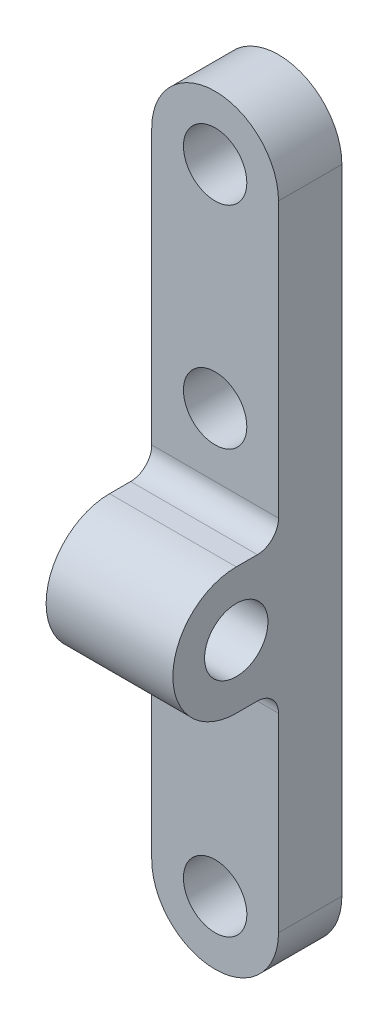
ISO-10303-21;
HEADER;
FILE_DESCRIPTION(('STEP AP214'),'2;1');
FILE_NAME('part.step','',(''),(''),'','','');
FILE_SCHEMA(('AUTOMOTIVE_DESIGN { 1 0 10303 214 1 1 1 1 }'));
ENDSEC;
DATA;
#1=APPLICATION_CONTEXT('core data for automotive mechanical design processes');
#2=APPLICATION_PROTOCOL_DEFINITION('international standard','automotive_design',2000,#1);
#3=PRODUCT_CONTEXT('',#1,'mechanical');
#4=PRODUCT('Part','Part','',(#3));
#5=PRODUCT_RELATED_PRODUCT_CATEGORY('part','',(#4));
#6=PRODUCT_DEFINITION_FORMATION('','',#4);
#7=PRODUCT_DEFINITION_CONTEXT('part definition',#1,'design');
#8=PRODUCT_DEFINITION('design','',#6,#7);
#9=PRODUCT_DEFINITION_SHAPE('','',#8);
#10=(LENGTH_UNIT() NAMED_UNIT(*) SI_UNIT(.MILLI.,.METRE.));
#11=(NAMED_UNIT(*) PLANE_ANGLE_UNIT() SI_UNIT($,.RADIAN.));
#12=(NAMED_UNIT(*) SI_UNIT($,.STERADIAN.) SOLID_ANGLE_UNIT());
#13=UNCERTAINTY_MEASURE_WITH_UNIT(LENGTH_MEASURE(1.E-05),#10,'distance_accuracy_value','');
#14=(GEOMETRIC_REPRESENTATION_CONTEXT(3) GLOBAL_UNCERTAINTY_ASSIGNED_CONTEXT((#13)) GLOBAL_UNIT_ASSIGNED_CONTEXT((#10,
#11,#12)) REPRESENTATION_CONTEXT('',''));
#15=CARTESIAN_POINT('',(0.,0.,0.));
#16=DIRECTION('',(0.,0.,1.));
#17=DIRECTION('',(1.,0.,0.));
#18=AXIS2_PLACEMENT_3D('',#15,#16,#17);
#19=CARTESIAN_POINT('',(0.,0.,3.));
#20=DIRECTION('',(0.,0.,1.));
#21=DIRECTION('',(1.,0.,0.));
#22=AXIS2_PLACEMENT_3D('',#19,#20,#21);
#23=PLANE('',#22);
#24=CARTESIAN_POINT('',(0.,-10.,3.));
#25=DIRECTION('',(0.,0.,1.));
#26=DIRECTION('',(1.,0.,0.));
#27=AXIS2_PLACEMENT_3D('',#24,#25,#26);
#28=CIRCLE('',#27,1.5);
#29=CARTESIAN_POINT('',(1.5,-10.,3.));
#30=VERTEX_POINT('',#29);
#31=EDGE_CURVE('E237',#30,#30,#28,.T.);
#32=ORIENTED_EDGE('',*,*,#31,.F.);
#33=EDGE_LOOP('',(#32));
#34=FACE_BOUND('',#33,.T.);
#35=DIRECTION('',(0.,-1.,0.));
#36=VECTOR('',#35,1.);
#37=CARTESIAN_POINT('',(-3.,0.,3.));
#38=LINE('',#37,#36);
#39=CARTESIAN_POINT('',(-3.,0.,3.));
#40=VERTEX_POINT('',#39);
#41=CARTESIAN_POINT('',(-3.,-13.,3.));
#42=VERTEX_POINT('',#41);
#43=EDGE_CURVE('E162',#40,#42,#38,.T.);
#44=ORIENTED_EDGE('',*,*,#43,.T.);
#45=DIRECTION('',(-1.,0.,0.));
#46=VECTOR('',#45,1.);
#47=CARTESIAN_POINT('',(3.,-13.,3.));
#48=LINE('',#47,#46);
#49=CARTESIAN_POINT('',(3.,-13.,3.));
#50=VERTEX_POINT('',#49);
#51=EDGE_CURVE('E55',#42,#50,#48,.F.);
#52=ORIENTED_EDGE('',*,*,#51,.T.);
#53=DIRECTION('',(0.,1.,0.));
#54=VECTOR('',#53,1.);
#55=CARTESIAN_POINT('',(3.,0.,3.));
#56=LINE('',#55,#54);
#57=CARTESIAN_POINT('',(3.,0.,3.));
#58=VERTEX_POINT('',#57);
#59=EDGE_CURVE('E166',#50,#58,#56,.T.);
#60=ORIENTED_EDGE('',*,*,#59,.T.);
#61=CARTESIAN_POINT('',(0.,0.,3.));
#62=DIRECTION('',(0.,0.,1.));
#63=DIRECTION('',(1.,0.,0.));
#64=AXIS2_PLACEMENT_3D('',#61,#62,#63);
#65=CIRCLE('',#64,3.);
#66=EDGE_CURVE('E157',#58,#40,#65,.T.);
#67=ORIENTED_EDGE('',*,*,#66,.T.);
#68=EDGE_LOOP('',(#44,#52,#60,#67));
#69=FACE_BOUND('',#68,.T.);
#70=CARTESIAN_POINT('',(0.,0.,3.));
#71=DIRECTION('',(0.,0.,1.));
#72=DIRECTION('',(1.,0.,0.));
#73=AXIS2_PLACEMENT_3D('',#70,#71,#72);
#74=CIRCLE('',#73,1.5);
#75=CARTESIAN_POINT('',(1.5,0.,3.));
#76=VERTEX_POINT('',#75);
#77=EDGE_CURVE('E151',#76,#76,#74,.T.);
#78=ORIENTED_EDGE('',*,*,#77,.F.);
#79=EDGE_LOOP('',(#78));
#80=FACE_BOUND('',#79,.T.);
#81=ADVANCED_FACE('F34',(#34,#69,#80),#23,.T.);
#82=CARTESIAN_POINT('',(3.,-30.,3.));
#83=VERTEX_POINT('',#82);
#84=CARTESIAN_POINT('',(3.,-21.,3.));
#85=VERTEX_POINT('',#84);
#86=EDGE_CURVE('E167',#83,#85,#56,.T.);
#87=ORIENTED_EDGE('',*,*,#86,.T.);
#88=DIRECTION('',(1.,0.,0.));
#89=VECTOR('',#88,1.);
#90=CARTESIAN_POINT('',(-3.,-21.,3.));
#91=LINE('',#90,#89);
#92=CARTESIAN_POINT('',(-3.,-21.,3.));
#93=VERTEX_POINT('',#92);
#94=EDGE_CURVE('E192',#85,#93,#91,.F.);
#95=ORIENTED_EDGE('',*,*,#94,.T.);
#96=CARTESIAN_POINT('',(-3.,-30.,3.));
#97=VERTEX_POINT('',#96);
#98=EDGE_CURVE('E160',#93,#97,#38,.T.);
#99=ORIENTED_EDGE('',*,*,#98,.T.);
#100=CARTESIAN_POINT('',(0.,-30.,3.));
#101=DIRECTION('',(0.,0.,1.));
#102=DIRECTION('',(-1.,0.,0.));
#103=AXIS2_PLACEMENT_3D('',#100,#101,#102);
#104=CIRCLE('',#103,3.);
#105=EDGE_CURVE('E164',#97,#83,#104,.T.);
#106=ORIENTED_EDGE('',*,*,#105,.T.);
#107=EDGE_LOOP('',(#87,#95,#99,#106));
#108=FACE_BOUND('',#107,.T.);
#109=CARTESIAN_POINT('',(0.,-30.,3.));
#110=DIRECTION('',(0.,0.,1.));
#111=DIRECTION('',(-1.,0.,0.));
#112=AXIS2_PLACEMENT_3D('',#109,#110,#111);
#113=CIRCLE('',#112,1.5);
#114=CARTESIAN_POINT('',(-1.5,-30.,3.));
#115=VERTEX_POINT('',#114);
#116=EDGE_CURVE('E145',#115,#115,#113,.T.);
#117=ORIENTED_EDGE('',*,*,#116,.F.);
#118=EDGE_LOOP('',(#117));
#119=FACE_BOUND('',#118,.T.);
#120=ADVANCED_FACE('F216',(#108,#119),#23,.T.);
#121=CARTESIAN_POINT('',(0.,0.,0.));
#122=DIRECTION('',(0.,0.,1.));
#123=DIRECTION('',(1.,0.,0.));
#124=AXIS2_PLACEMENT_3D('',#121,#122,#123);
#125=PLANE('',#124);
#126=CARTESIAN_POINT('',(0.,-10.,0.));
#127=DIRECTION('',(0.,0.,-1.));
#128=DIRECTION('',(-1.,0.,0.));
#129=AXIS2_PLACEMENT_3D('',#126,#127,#128);
#130=CIRCLE('',#129,1.5);
#131=CARTESIAN_POINT('',(-1.5,-10.,0.));
#132=VERTEX_POINT('',#131);
#133=EDGE_CURVE('E243',#132,#132,#130,.T.);
#134=ORIENTED_EDGE('',*,*,#133,.F.);
#135=EDGE_LOOP('',(#134));
#136=FACE_BOUND('',#135,.T.);
#137=CARTESIAN_POINT('',(0.,-30.,0.));
#138=DIRECTION('',(0.,0.,1.));
#139=DIRECTION('',(-1.,0.,0.));
#140=AXIS2_PLACEMENT_3D('',#137,#138,#139);
#141=CIRCLE('',#140,3.);
#142=CARTESIAN_POINT('',(-3.,-30.,0.));
#143=VERTEX_POINT('',#142);
#144=CARTESIAN_POINT('',(3.,-30.,0.));
#145=VERTEX_POINT('',#144);
#146=EDGE_CURVE('E175',#143,#145,#141,.T.);
#147=ORIENTED_EDGE('',*,*,#146,.F.);
#148=DIRECTION('',(0.,-1.,0.));
#149=VECTOR('',#148,1.);
#150=CARTESIAN_POINT('',(-3.,0.,0.));
#151=LINE('',#150,#149);
#152=CARTESIAN_POINT('',(-3.,0.,0.));
#153=VERTEX_POINT('',#152);
#154=EDGE_CURVE('E173',#153,#143,#151,.T.);
#155=ORIENTED_EDGE('',*,*,#154,.F.);
#156=CARTESIAN_POINT('',(0.,0.,0.));
#157=DIRECTION('',(0.,0.,1.));
#158=DIRECTION('',(1.,0.,0.));
#159=AXIS2_PLACEMENT_3D('',#156,#157,#158);
#160=CIRCLE('',#159,3.);
#161=CARTESIAN_POINT('',(3.,0.,0.));
#162=VERTEX_POINT('',#161);
#163=EDGE_CURVE('E154',#162,#153,#160,.T.);
#164=ORIENTED_EDGE('',*,*,#163,.F.);
#165=DIRECTION('',(0.,1.,0.));
#166=VECTOR('',#165,1.);
#167=CARTESIAN_POINT('',(3.,0.,0.));
#168=LINE('',#167,#166);
#169=EDGE_CURVE('E161',#145,#162,#168,.T.);
#170=ORIENTED_EDGE('',*,*,#169,.F.);
#171=EDGE_LOOP('',(#147,#155,#164,#170));
#172=FACE_BOUND('',#171,.T.);
#173=CARTESIAN_POINT('',(0.,-30.,0.));
#174=DIRECTION('',(0.,0.,1.));
#175=DIRECTION('',(-1.,0.,0.));
#176=AXIS2_PLACEMENT_3D('',#173,#174,#175);
#177=CIRCLE('',#176,1.5);
#178=CARTESIAN_POINT('',(-1.5,-30.,0.));
#179=VERTEX_POINT('',#178);
#180=EDGE_CURVE('E144',#179,#179,#177,.T.);
#181=ORIENTED_EDGE('',*,*,#180,.T.);
#182=EDGE_LOOP('',(#181));
#183=FACE_BOUND('',#182,.T.);
#184=CARTESIAN_POINT('',(0.,0.,0.));
#185=DIRECTION('',(0.,0.,1.));
#186=DIRECTION('',(1.,0.,0.));
#187=AXIS2_PLACEMENT_3D('',#184,#185,#186);
#188=CIRCLE('',#187,1.5);
#189=CARTESIAN_POINT('',(1.5,0.,0.));
#190=VERTEX_POINT('',#189);
#191=EDGE_CURVE('E148',#190,#190,#188,.T.);
#192=ORIENTED_EDGE('',*,*,#191,.T.);
#193=EDGE_LOOP('',(#192));
#194=FACE_BOUND('',#193,.T.);
#195=ADVANCED_FACE('F227',(#136,#172,#183,#194),#125,.F.);
#196=CARTESIAN_POINT('',(0.,0.,3.));
#197=DIRECTION('',(0.,0.,-1.));
#198=DIRECTION('',(-1.,0.,0.));
#199=AXIS2_PLACEMENT_3D('',#196,#197,#198);
#200=CYLINDRICAL_SURFACE('',#199,3.);
#201=ORIENTED_EDGE('',*,*,#163,.T.);
#202=DIRECTION('',(0.,0.,-1.));
#203=VECTOR('',#202,1.);
#204=CARTESIAN_POINT('',(-3.,0.,3.));
#205=LINE('',#204,#203);
#206=EDGE_CURVE('E186',#40,#153,#205,.T.);
#207=ORIENTED_EDGE('',*,*,#206,.F.);
#208=ORIENTED_EDGE('',*,*,#66,.F.);
#209=DIRECTION('',(0.,0.,-1.));
#210=VECTOR('',#209,1.);
#211=CARTESIAN_POINT('',(3.,0.,3.));
#212=LINE('',#211,#210);
#213=EDGE_CURVE('E170',#58,#162,#212,.T.);
#214=ORIENTED_EDGE('',*,*,#213,.T.);
#215=EDGE_LOOP('',(#201,#207,#208,#214));
#216=FACE_BOUND('',#215,.T.);
#217=ADVANCED_FACE('F231',(#216),#200,.T.);
#218=CARTESIAN_POINT('',(-3.,0.,3.));
#219=DIRECTION('',(1.,0.,0.));
#220=DIRECTION('',(0.,1.,0.));
#221=AXIS2_PLACEMENT_3D('',#218,#219,#220);
#222=PLANE('',#221);
#223=ORIENTED_EDGE('',*,*,#98,.F.);
#224=CARTESIAN_POINT('',(-3.,-21.,4.));
#225=DIRECTION('',(1.,0.,0.));
#226=DIRECTION('',(0.,1.,0.));
#227=AXIS2_PLACEMENT_3D('',#224,#225,#226);
#228=CIRCLE('',#227,1.);
#229=CARTESIAN_POINT('',(-3.,-20.,4.));
#230=VERTEX_POINT('',#229);
#231=EDGE_CURVE('E199',#93,#230,#228,.T.);
#232=ORIENTED_EDGE('',*,*,#231,.T.);
#233=DIRECTION('',(0.,0.,1.));
#234=VECTOR('',#233,1.);
#235=CARTESIAN_POINT('',(-3.,-20.,5.));
#236=LINE('',#235,#234);
#237=CARTESIAN_POINT('',(-3.,-20.,5.));
#238=VERTEX_POINT('',#237);
#239=EDGE_CURVE('E205',#230,#238,#236,.T.);
#240=ORIENTED_EDGE('',*,*,#239,.T.);
#241=CARTESIAN_POINT('',(-3.,-17.,5.));
#242=DIRECTION('',(1.,0.,0.));
#243=DIRECTION('',(0.,1.,0.));
#244=AXIS2_PLACEMENT_3D('',#241,#242,#243);
#245=CIRCLE('',#244,3.);
#246=CARTESIAN_POINT('',(-3.,-14.,5.));
#247=VERTEX_POINT('',#246);
#248=EDGE_CURVE('E139',#238,#247,#245,.F.);
#249=ORIENTED_EDGE('',*,*,#248,.T.);
#250=DIRECTION('',(0.,0.,-1.));
#251=VECTOR('',#250,1.);
#252=CARTESIAN_POINT('',(-3.,-14.,0.));
#253=LINE('',#252,#251);
#254=CARTESIAN_POINT('',(-3.,-14.,4.));
#255=VERTEX_POINT('',#254);
#256=EDGE_CURVE('E127',#247,#255,#253,.T.);
#257=ORIENTED_EDGE('',*,*,#256,.T.);
#258=CARTESIAN_POINT('',(-3.,-13.,4.));
#259=DIRECTION('',(1.,0.,0.));
#260=DIRECTION('',(0.,1.,0.));
#261=AXIS2_PLACEMENT_3D('',#258,#259,#260);
#262=CIRCLE('',#261,1.);
#263=EDGE_CURVE('E42',#255,#42,#262,.T.);
#264=ORIENTED_EDGE('',*,*,#263,.T.);
#265=ORIENTED_EDGE('',*,*,#43,.F.);
#266=ORIENTED_EDGE('',*,*,#206,.T.);
#267=ORIENTED_EDGE('',*,*,#154,.T.);
#268=DIRECTION('',(0.,0.,-1.));
#269=VECTOR('',#268,1.);
#270=CARTESIAN_POINT('',(-3.,-30.,3.));
#271=LINE('',#270,#269);
#272=EDGE_CURVE('E183',#97,#143,#271,.T.);
#273=ORIENTED_EDGE('',*,*,#272,.F.);
#274=EDGE_LOOP('',(#223,#232,#240,#249,#257,#264,#265,#266,#267,#273));
#275=FACE_BOUND('',#274,.T.);
#276=CARTESIAN_POINT('',(-3.,-17.,5.));
#277=DIRECTION('',(1.,0.,0.));
#278=DIRECTION('',(0.,1.,0.));
#279=AXIS2_PLACEMENT_3D('',#276,#277,#278);
#280=CIRCLE('',#279,1.5);
#281=CARTESIAN_POINT('',(-3.,-15.5,5.));
#282=VERTEX_POINT('',#281);
#283=EDGE_CURVE('E141',#282,#282,#280,.F.);
#284=ORIENTED_EDGE('',*,*,#283,.F.);
#285=EDGE_LOOP('',(#284));
#286=FACE_BOUND('',#285,.T.);
#287=ADVANCED_FACE('F203',(#275,#286),#222,.F.);
#288=CARTESIAN_POINT('',(0.,-30.,3.));
#289=DIRECTION('',(0.,0.,-1.));
#290=DIRECTION('',(-1.,0.,0.));
#291=AXIS2_PLACEMENT_3D('',#288,#289,#290);
#292=CYLINDRICAL_SURFACE('',#291,3.);
#293=ORIENTED_EDGE('',*,*,#146,.T.);
#294=DIRECTION('',(0.,0.,-1.));
#295=VECTOR('',#294,1.);
#296=CARTESIAN_POINT('',(3.,-30.,3.));
#297=LINE('',#296,#295);
#298=EDGE_CURVE('E180',#83,#145,#297,.T.);
#299=ORIENTED_EDGE('',*,*,#298,.F.);
#300=ORIENTED_EDGE('',*,*,#105,.F.);
#301=ORIENTED_EDGE('',*,*,#272,.T.);
#302=EDGE_LOOP('',(#293,#299,#300,#301));
#303=FACE_BOUND('',#302,.T.);
#304=ADVANCED_FACE('F221',(#303),#292,.T.);
#305=CARTESIAN_POINT('',(3.,0.,3.));
#306=DIRECTION('',(-1.,0.,0.));
#307=DIRECTION('',(0.,-1.,0.));
#308=AXIS2_PLACEMENT_3D('',#305,#306,#307);
#309=PLANE('',#308);
#310=ORIENTED_EDGE('',*,*,#169,.T.);
#311=ORIENTED_EDGE('',*,*,#213,.F.);
#312=ORIENTED_EDGE('',*,*,#59,.F.);
#313=CARTESIAN_POINT('',(3.,-13.,4.));
#314=DIRECTION('',(-1.,0.,0.));
#315=DIRECTION('',(0.,-1.,0.));
#316=AXIS2_PLACEMENT_3D('',#313,#314,#315);
#317=CIRCLE('',#316,1.);
#318=CARTESIAN_POINT('',(3.,-14.,4.));
#319=VERTEX_POINT('',#318);
#320=EDGE_CURVE('E11',#50,#319,#317,.T.);
#321=ORIENTED_EDGE('',*,*,#320,.T.);
#322=DIRECTION('',(0.,0.,1.));
#323=VECTOR('',#322,1.);
#324=CARTESIAN_POINT('',(3.,-14.,0.));
#325=LINE('',#324,#323);
#326=CARTESIAN_POINT('',(3.,-14.,5.));
#327=VERTEX_POINT('',#326);
#328=EDGE_CURVE('E109',#319,#327,#325,.T.);
#329=ORIENTED_EDGE('',*,*,#328,.T.);
#330=CARTESIAN_POINT('',(3.,-17.,5.));
#331=DIRECTION('',(1.,0.,0.));
#332=DIRECTION('',(0.,-1.,0.));
#333=AXIS2_PLACEMENT_3D('',#330,#331,#332);
#334=CIRCLE('',#333,3.);
#335=CARTESIAN_POINT('',(3.,-20.,5.));
#336=VERTEX_POINT('',#335);
#337=EDGE_CURVE('E115',#327,#336,#334,.T.);
#338=ORIENTED_EDGE('',*,*,#337,.T.);
#339=DIRECTION('',(0.,0.,-1.));
#340=VECTOR('',#339,1.);
#341=CARTESIAN_POINT('',(3.,-20.,5.));
#342=LINE('',#341,#340);
#343=CARTESIAN_POINT('',(3.,-20.,4.));
#344=VERTEX_POINT('',#343);
#345=EDGE_CURVE('E131',#336,#344,#342,.T.);
#346=ORIENTED_EDGE('',*,*,#345,.T.);
#347=CARTESIAN_POINT('',(3.,-21.,4.));
#348=DIRECTION('',(-1.,0.,0.));
#349=DIRECTION('',(0.,-1.,0.));
#350=AXIS2_PLACEMENT_3D('',#347,#348,#349);
#351=CIRCLE('',#350,1.);
#352=EDGE_CURVE('E197',#344,#85,#351,.T.);
#353=ORIENTED_EDGE('',*,*,#352,.T.);
#354=ORIENTED_EDGE('',*,*,#86,.F.);
#355=ORIENTED_EDGE('',*,*,#298,.T.);
#356=EDGE_LOOP('',(#310,#311,#312,#321,#329,#338,#346,#353,#354,#355));
#357=FACE_BOUND('',#356,.T.);
#358=CARTESIAN_POINT('',(3.,-17.,5.));
#359=DIRECTION('',(1.,0.,0.));
#360=DIRECTION('',(0.,1.,0.));
#361=AXIS2_PLACEMENT_3D('',#358,#359,#360);
#362=CIRCLE('',#361,1.5);
#363=CARTESIAN_POINT('',(3.,-15.5,5.));
#364=VERTEX_POINT('',#363);
#365=EDGE_CURVE('E121',#364,#364,#362,.T.);
#366=ORIENTED_EDGE('',*,*,#365,.F.);
#367=EDGE_LOOP('',(#366));
#368=FACE_BOUND('',#367,.T.);
#369=ADVANCED_FACE('F111',(#357,#368),#309,.F.);
#370=CARTESIAN_POINT('',(0.,0.,3.));
#371=DIRECTION('',(0.,0.,-1.));
#372=DIRECTION('',(-1.,0.,0.));
#373=AXIS2_PLACEMENT_3D('',#370,#371,#372);
#374=CYLINDRICAL_SURFACE('',#373,1.5);
#375=ORIENTED_EDGE('',*,*,#77,.T.);
#376=EDGE_LOOP('',(#375));
#377=FACE_BOUND('',#376,.T.);
#378=ORIENTED_EDGE('',*,*,#191,.F.);
#379=EDGE_LOOP('',(#378));
#380=FACE_BOUND('',#379,.T.);
#381=ADVANCED_FACE('F265',(#377,#380),#374,.F.);
#382=CARTESIAN_POINT('',(0.,-30.,3.));
#383=DIRECTION('',(0.,0.,-1.));
#384=DIRECTION('',(-1.,0.,0.));
#385=AXIS2_PLACEMENT_3D('',#382,#383,#384);
#386=CYLINDRICAL_SURFACE('',#385,1.5);
#387=ORIENTED_EDGE('',*,*,#116,.T.);
#388=EDGE_LOOP('',(#387));
#389=FACE_BOUND('',#388,.T.);
#390=ORIENTED_EDGE('',*,*,#180,.F.);
#391=EDGE_LOOP('',(#390));
#392=FACE_BOUND('',#391,.T.);
#393=ADVANCED_FACE('F268',(#389,#392),#386,.F.);
#394=CARTESIAN_POINT('',(-13.,-14.,0.));
#395=DIRECTION('',(0.,1.,0.));
#396=DIRECTION('',(-1.,0.,0.));
#397=AXIS2_PLACEMENT_3D('',#394,#395,#396);
#398=PLANE('',#397);
#399=ORIENTED_EDGE('',*,*,#328,.F.);
#400=DIRECTION('',(-1.,0.,0.));
#401=VECTOR('',#400,1.);
#402=CARTESIAN_POINT('',(-3.,-14.,4.));
#403=LINE('',#402,#401);
#404=EDGE_CURVE('E194',#319,#255,#403,.T.);
#405=ORIENTED_EDGE('',*,*,#404,.T.);
#406=ORIENTED_EDGE('',*,*,#256,.F.);
#407=DIRECTION('',(1.,0.,0.));
#408=VECTOR('',#407,1.);
#409=CARTESIAN_POINT('',(-13.,-14.,5.));
#410=LINE('',#409,#408);
#411=EDGE_CURVE('E125',#247,#327,#410,.T.);
#412=ORIENTED_EDGE('',*,*,#411,.T.);
#413=EDGE_LOOP('',(#399,#405,#406,#412));
#414=FACE_BOUND('',#413,.T.);
#415=ADVANCED_FACE('F126',(#414),#398,.T.);
#416=CARTESIAN_POINT('',(-13.,-17.,5.));
#417=DIRECTION('',(1.,0.,0.));
#418=DIRECTION('',(0.,1.,0.));
#419=AXIS2_PLACEMENT_3D('',#416,#417,#418);
#420=CYLINDRICAL_SURFACE('',#419,3.);
#421=ORIENTED_EDGE('',*,*,#248,.F.);
#422=DIRECTION('',(1.,0.,0.));
#423=VECTOR('',#422,1.);
#424=CARTESIAN_POINT('',(-13.,-20.,5.));
#425=LINE('',#424,#423);
#426=EDGE_CURVE('E130',#238,#336,#425,.T.);
#427=ORIENTED_EDGE('',*,*,#426,.T.);
#428=ORIENTED_EDGE('',*,*,#337,.F.);
#429=ORIENTED_EDGE('',*,*,#411,.F.);
#430=EDGE_LOOP('',(#421,#427,#428,#429));
#431=FACE_BOUND('',#430,.T.);
#432=ADVANCED_FACE('F133',(#431),#420,.T.);
#433=CARTESIAN_POINT('',(-13.,-20.,5.));
#434=DIRECTION('',(0.,-1.,0.));
#435=DIRECTION('',(1.,0.,0.));
#436=AXIS2_PLACEMENT_3D('',#433,#434,#435);
#437=PLANE('',#436);
#438=ORIENTED_EDGE('',*,*,#239,.F.);
#439=DIRECTION('',(1.,0.,0.));
#440=VECTOR('',#439,1.);
#441=CARTESIAN_POINT('',(3.,-20.,4.));
#442=LINE('',#441,#440);
#443=EDGE_CURVE('E189',#230,#344,#442,.T.);
#444=ORIENTED_EDGE('',*,*,#443,.T.);
#445=ORIENTED_EDGE('',*,*,#345,.F.);
#446=ORIENTED_EDGE('',*,*,#426,.F.);
#447=EDGE_LOOP('',(#438,#444,#445,#446));
#448=FACE_BOUND('',#447,.T.);
#449=ADVANCED_FACE('F211',(#448),#437,.T.);
#450=CARTESIAN_POINT('',(-13.,-17.,5.));
#451=DIRECTION('',(1.,0.,0.));
#452=DIRECTION('',(0.,1.,0.));
#453=AXIS2_PLACEMENT_3D('',#450,#451,#452);
#454=CYLINDRICAL_SURFACE('',#453,1.5);
#455=ORIENTED_EDGE('',*,*,#283,.T.);
#456=EDGE_LOOP('',(#455));
#457=FACE_BOUND('',#456,.T.);
#458=ORIENTED_EDGE('',*,*,#365,.T.);
#459=EDGE_LOOP('',(#458));
#460=FACE_BOUND('',#459,.T.);
#461=ADVANCED_FACE('F279',(#457,#460),#454,.F.);
#462=CARTESIAN_POINT('',(-13.,-21.,4.));
#463=DIRECTION('',(-1.,0.,0.));
#464=DIRECTION('',(0.,-1.,0.));
#465=AXIS2_PLACEMENT_3D('',#462,#463,#464);
#466=CYLINDRICAL_SURFACE('',#465,1.);
#467=ORIENTED_EDGE('',*,*,#231,.F.);
#468=ORIENTED_EDGE('',*,*,#94,.F.);
#469=ORIENTED_EDGE('',*,*,#352,.F.);
#470=ORIENTED_EDGE('',*,*,#443,.F.);
#471=EDGE_LOOP('',(#467,#468,#469,#470));
#472=FACE_BOUND('',#471,.T.);
#473=ADVANCED_FACE('F213',(#472),#466,.F.);
#474=CARTESIAN_POINT('',(-13.,-13.,4.));
#475=DIRECTION('',(1.,0.,0.));
#476=DIRECTION('',(0.,1.,0.));
#477=AXIS2_PLACEMENT_3D('',#474,#475,#476);
#478=CYLINDRICAL_SURFACE('',#477,1.);
#479=ORIENTED_EDGE('',*,*,#320,.F.);
#480=ORIENTED_EDGE('',*,*,#51,.F.);
#481=ORIENTED_EDGE('',*,*,#263,.F.);
#482=ORIENTED_EDGE('',*,*,#404,.F.);
#483=EDGE_LOOP('',(#479,#480,#481,#482));
#484=FACE_BOUND('',#483,.T.);
#485=ADVANCED_FACE('F36',(#484),#478,.F.);
#486=CARTESIAN_POINT('',(0.,-10.,10.));
#487=DIRECTION('',(0.,0.,-1.));
#488=DIRECTION('',(-1.,0.,0.));
#489=AXIS2_PLACEMENT_3D('',#486,#487,#488);
#490=CYLINDRICAL_SURFACE('',#489,1.5);
#491=ORIENTED_EDGE('',*,*,#31,.T.);
#492=EDGE_LOOP('',(#491));
#493=FACE_BOUND('',#492,.T.);
#494=ORIENTED_EDGE('',*,*,#133,.T.);
#495=EDGE_LOOP('',(#494));
#496=FACE_BOUND('',#495,.T.);
#497=ADVANCED_FACE('F249',(#493,#496),#490,.F.);
#498=CLOSED_SHELL('',(#81,#120,#195,#217,#287,#304,#369,#381,#393,#415,#432,#449,#461,#473,#485,#497));
#499=MANIFOLD_SOLID_BREP('B2',#498);
#500=ADVANCED_BREP_SHAPE_REPRESENTATION('',(#18,#499),#14);
#501=SHAPE_DEFINITION_REPRESENTATION(#9,#500);
ENDSEC;
END-ISO-10303-21;
